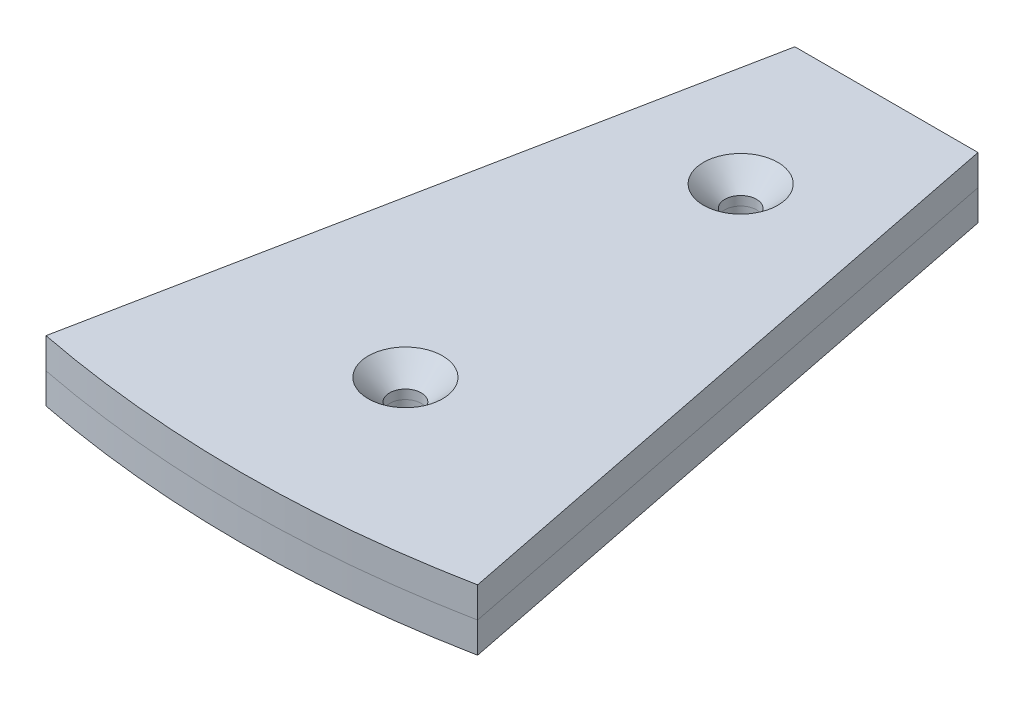
ISO-10303-21;
HEADER;
FILE_DESCRIPTION(('STEP AP214'),'2;1');
FILE_NAME('part.step','',(''),(''),'','','');
FILE_SCHEMA(('AUTOMOTIVE_DESIGN { 1 0 10303 214 1 1 1 1 }'));
ENDSEC;
DATA;
#1=APPLICATION_CONTEXT('core data for automotive mechanical design processes');
#2=APPLICATION_PROTOCOL_DEFINITION('international standard','automotive_design',2000,#1);
#3=PRODUCT_CONTEXT('',#1,'mechanical');
#4=PRODUCT('Part','Part','',(#3));
#5=PRODUCT_RELATED_PRODUCT_CATEGORY('part','',(#4));
#6=PRODUCT_DEFINITION_FORMATION('','',#4);
#7=PRODUCT_DEFINITION_CONTEXT('part definition',#1,'design');
#8=PRODUCT_DEFINITION('design','',#6,#7);
#9=PRODUCT_DEFINITION_SHAPE('','',#8);
#10=(LENGTH_UNIT() NAMED_UNIT(*) SI_UNIT(.MILLI.,.METRE.));
#11=(NAMED_UNIT(*) PLANE_ANGLE_UNIT() SI_UNIT($,.RADIAN.));
#12=(NAMED_UNIT(*) SI_UNIT($,.STERADIAN.) SOLID_ANGLE_UNIT());
#13=UNCERTAINTY_MEASURE_WITH_UNIT(LENGTH_MEASURE(1.E-05),#10,'distance_accuracy_value','');
#14=(GEOMETRIC_REPRESENTATION_CONTEXT(3) GLOBAL_UNCERTAINTY_ASSIGNED_CONTEXT((#13)) GLOBAL_UNIT_ASSIGNED_CONTEXT((#10,
#11,#12)) REPRESENTATION_CONTEXT('',''));
#15=CARTESIAN_POINT('',(0.,0.,0.));
#16=DIRECTION('',(0.,0.,1.));
#17=DIRECTION('',(1.,0.,0.));
#18=AXIS2_PLACEMENT_3D('',#15,#16,#17);
#19=CARTESIAN_POINT('',(0.,4.99,0.));
#20=DIRECTION('',(0.,-1.,0.));
#21=DIRECTION('',(0.,0.,-1.));
#22=AXIS2_PLACEMENT_3D('',#19,#20,#21);
#23=PLANE('',#22);
#24=DIRECTION('',(-1.,0.,0.));
#25=VECTOR('',#24,1.);
#26=CARTESIAN_POINT('',(0.,4.99,78.0836992813795));
#27=LINE('',#26,#25);
#28=CARTESIAN_POINT('',(15.0220178987158,4.99,78.0836992813795));
#29=VERTEX_POINT('',#28);
#30=CARTESIAN_POINT('',(-15.0220178987157,4.99,78.0836992813795));
#31=VERTEX_POINT('',#30);
#32=EDGE_CURVE('E62',#29,#31,#27,.T.);
#33=ORIENTED_EDGE('',*,*,#32,.F.);
#34=DIRECTION('',(0.195090322016121,0.,0.980785280403232));
#35=VECTOR('',#34,1.);
#36=CARTESIAN_POINT('',(14.1410563568579,4.99,73.6548065309534));
#37=LINE('',#36,#35);
#38=CARTESIAN_POINT('',(35.4060940763339,4.99,180.561370459625));
#39=VERTEX_POINT('',#38);
#40=EDGE_CURVE('E106',#29,#39,#37,.T.);
#41=ORIENTED_EDGE('',*,*,#40,.T.);
#42=CARTESIAN_POINT('',(0.,4.99,0.));
#43=DIRECTION('',(0.,-1.,0.));
#44=DIRECTION('',(0.,0.,-1.));
#45=AXIS2_PLACEMENT_3D('',#42,#43,#44);
#46=CIRCLE('',#45,184.);
#47=CARTESIAN_POINT('',(-35.4060940763338,4.99,180.561370459625));
#48=VERTEX_POINT('',#47);
#49=EDGE_CURVE('E70',#39,#48,#46,.T.);
#50=ORIENTED_EDGE('',*,*,#49,.T.);
#51=DIRECTION('',(0.195090322016121,0.,-0.980785280403232));
#52=VECTOR('',#51,1.);
#53=CARTESIAN_POINT('',(-14.1410563568579,4.99,73.6548065309534));
#54=LINE('',#53,#52);
#55=EDGE_CURVE('E100',#48,#31,#54,.T.);
#56=ORIENTED_EDGE('',*,*,#55,.T.);
#57=EDGE_LOOP('',(#33,#41,#50,#56));
#58=FACE_BOUND('',#57,.T.);
#59=CARTESIAN_POINT('',(0.,4.99,157.));
#60=DIRECTION('',(0.,-1.,0.));
#61=DIRECTION('',(0.,0.,-1.));
#62=AXIS2_PLACEMENT_3D('',#59,#60,#61);
#63=CIRCLE('',#62,2.59999999999998);
#64=CARTESIAN_POINT('',(0.,4.99,154.4));
#65=VERTEX_POINT('',#64);
#66=EDGE_CURVE('E167',#65,#65,#63,.T.);
#67=ORIENTED_EDGE('',*,*,#66,.F.);
#68=EDGE_LOOP('',(#67));
#69=FACE_BOUND('',#68,.T.);
#70=CARTESIAN_POINT('',(0.,4.99,102.));
#71=DIRECTION('',(0.,-1.,0.));
#72=DIRECTION('',(0.,0.,1.));
#73=AXIS2_PLACEMENT_3D('',#70,#71,#72);
#74=CIRCLE('',#73,2.59999999999998);
#75=CARTESIAN_POINT('',(0.,4.99,104.6));
#76=VERTEX_POINT('',#75);
#77=EDGE_CURVE('E165',#76,#76,#74,.T.);
#78=ORIENTED_EDGE('',*,*,#77,.F.);
#79=EDGE_LOOP('',(#78));
#80=FACE_BOUND('',#79,.T.);
#81=ADVANCED_FACE('F46',(#58,#69,#80),#23,.T.);
#82=CARTESIAN_POINT('',(0.,9.99,0.));
#83=DIRECTION('',(0.,-1.,0.));
#84=DIRECTION('',(0.,0.,-1.));
#85=AXIS2_PLACEMENT_3D('',#82,#83,#84);
#86=PLANE('',#85);
#87=CARTESIAN_POINT('',(0.,9.99,102.));
#88=DIRECTION('',(0.,-1.,0.));
#89=DIRECTION('',(0.,0.,-1.));
#90=AXIS2_PLACEMENT_3D('',#87,#88,#89);
#91=CIRCLE('',#90,6.09999999999997);
#92=CARTESIAN_POINT('',(0.,9.99,95.9));
#93=VERTEX_POINT('',#92);
#94=EDGE_CURVE('E115',#93,#93,#91,.T.);
#95=ORIENTED_EDGE('',*,*,#94,.T.);
#96=EDGE_LOOP('',(#95));
#97=FACE_BOUND('',#96,.T.);
#98=CARTESIAN_POINT('',(0.,9.99,157.));
#99=DIRECTION('',(0.,-1.,0.));
#100=DIRECTION('',(0.,0.,-1.));
#101=AXIS2_PLACEMENT_3D('',#98,#99,#100);
#102=CIRCLE('',#101,6.09999999999999);
#103=CARTESIAN_POINT('',(0.,9.99,150.9));
#104=VERTEX_POINT('',#103);
#105=EDGE_CURVE('E112',#104,#104,#102,.T.);
#106=ORIENTED_EDGE('',*,*,#105,.T.);
#107=EDGE_LOOP('',(#106));
#108=FACE_BOUND('',#107,.T.);
#109=DIRECTION('',(0.195090322016121,0.,0.980785280403232));
#110=VECTOR('',#109,1.);
#111=CARTESIAN_POINT('',(14.1410563568579,9.99,73.6548065309534));
#112=LINE('',#111,#110);
#113=CARTESIAN_POINT('',(15.0220178987158,9.99,78.0836992813795));
#114=VERTEX_POINT('',#113);
#115=CARTESIAN_POINT('',(35.4060940763339,9.99,180.561370459625));
#116=VERTEX_POINT('',#115);
#117=EDGE_CURVE('E94',#114,#116,#112,.T.);
#118=ORIENTED_EDGE('',*,*,#117,.F.);
#119=DIRECTION('',(-1.,0.,0.));
#120=VECTOR('',#119,1.);
#121=CARTESIAN_POINT('',(-30.5248210778353,9.99,78.0836992813795));
#122=LINE('',#121,#120);
#123=CARTESIAN_POINT('',(-15.0220178987157,9.99,78.0836992813795));
#124=VERTEX_POINT('',#123);
#125=EDGE_CURVE('E105',#114,#124,#122,.T.);
#126=ORIENTED_EDGE('',*,*,#125,.T.);
#127=DIRECTION('',(0.195090322016121,0.,-0.980785280403232));
#128=VECTOR('',#127,1.);
#129=CARTESIAN_POINT('',(-14.1410563568579,9.99,73.6548065309534));
#130=LINE('',#129,#128);
#131=CARTESIAN_POINT('',(-35.4060940763338,9.99,180.561370459625));
#132=VERTEX_POINT('',#131);
#133=EDGE_CURVE('E93',#132,#124,#130,.T.);
#134=ORIENTED_EDGE('',*,*,#133,.F.);
#135=CARTESIAN_POINT('',(0.,9.99,0.));
#136=DIRECTION('',(0.,-1.,0.));
#137=DIRECTION('',(0.,0.,-1.));
#138=AXIS2_PLACEMENT_3D('',#135,#136,#137);
#139=CIRCLE('',#138,184.);
#140=EDGE_CURVE('E83',#116,#132,#139,.T.);
#141=ORIENTED_EDGE('',*,*,#140,.F.);
#142=EDGE_LOOP('',(#118,#126,#134,#141));
#143=FACE_BOUND('',#142,.T.);
#144=ADVANCED_FACE('F103',(#97,#108,#143),#86,.F.);
#145=CARTESIAN_POINT('',(14.1410563568579,4.99,73.6548065309534));
#146=DIRECTION('',(-0.980785280403232,0.,0.195090322016121));
#147=DIRECTION('',(0.195090322016121,0.,0.980785280403232));
#148=AXIS2_PLACEMENT_3D('',#145,#146,#147);
#149=PLANE('',#148);
#150=ORIENTED_EDGE('',*,*,#40,.F.);
#151=DIRECTION('',(0.,-1.,0.));
#152=VECTOR('',#151,1.);
#153=CARTESIAN_POINT('',(15.0220178987158,9.99,78.0836992813795));
#154=LINE('',#153,#152);
#155=EDGE_CURVE('E171',#114,#29,#154,.T.);
#156=ORIENTED_EDGE('',*,*,#155,.F.);
#157=ORIENTED_EDGE('',*,*,#117,.T.);
#158=DIRECTION('',(0.,1.,0.));
#159=VECTOR('',#158,1.);
#160=CARTESIAN_POINT('',(35.4060940763339,4.99,180.561370459625));
#161=LINE('',#160,#159);
#162=EDGE_CURVE('E89',#39,#116,#161,.T.);
#163=ORIENTED_EDGE('',*,*,#162,.F.);
#164=EDGE_LOOP('',(#150,#156,#157,#163));
#165=FACE_BOUND('',#164,.T.);
#166=ADVANCED_FACE('F133',(#165),#149,.F.);
#167=CARTESIAN_POINT('',(0.,4.99,0.));
#168=DIRECTION('',(0.,1.,0.));
#169=DIRECTION('',(0.,0.,1.));
#170=AXIS2_PLACEMENT_3D('',#167,#168,#169);
#171=CYLINDRICAL_SURFACE('',#170,184.);
#172=ORIENTED_EDGE('',*,*,#140,.T.);
#173=DIRECTION('',(0.,1.,0.));
#174=VECTOR('',#173,1.);
#175=CARTESIAN_POINT('',(-35.4060940763338,4.99,180.561370459625));
#176=LINE('',#175,#174);
#177=EDGE_CURVE('E86',#48,#132,#176,.T.);
#178=ORIENTED_EDGE('',*,*,#177,.F.);
#179=ORIENTED_EDGE('',*,*,#49,.F.);
#180=ORIENTED_EDGE('',*,*,#162,.T.);
#181=EDGE_LOOP('',(#172,#178,#179,#180));
#182=FACE_BOUND('',#181,.T.);
#183=ADVANCED_FACE('F85',(#182),#171,.T.);
#184=CARTESIAN_POINT('',(-14.1410563568579,4.99,73.6548065309534));
#185=DIRECTION('',(0.980785280403232,0.,0.195090322016121));
#186=DIRECTION('',(0.195090322016121,0.,-0.980785280403232));
#187=AXIS2_PLACEMENT_3D('',#184,#185,#186);
#188=PLANE('',#187);
#189=ORIENTED_EDGE('',*,*,#133,.T.);
#190=DIRECTION('',(0.,-1.,0.));
#191=VECTOR('',#190,1.);
#192=CARTESIAN_POINT('',(-15.0220178987157,4.99,78.0836992813795));
#193=LINE('',#192,#191);
#194=EDGE_CURVE('E12',#124,#31,#193,.T.);
#195=ORIENTED_EDGE('',*,*,#194,.T.);
#196=ORIENTED_EDGE('',*,*,#55,.F.);
#197=ORIENTED_EDGE('',*,*,#177,.T.);
#198=EDGE_LOOP('',(#189,#195,#196,#197));
#199=FACE_BOUND('',#198,.T.);
#200=ADVANCED_FACE('F98',(#199),#188,.F.);
#201=CARTESIAN_POINT('',(0.,4.99,157.));
#202=DIRECTION('',(0.,1.,0.));
#203=DIRECTION('',(0.,0.,1.));
#204=AXIS2_PLACEMENT_3D('',#201,#202,#203);
#205=CYLINDRICAL_SURFACE('',#204,2.59999999999998);
#206=CARTESIAN_POINT('',(0.,6.49000000000001,157.));
#207=DIRECTION('',(0.,-1.,0.));
#208=DIRECTION('',(0.,0.,-1.));
#209=AXIS2_PLACEMENT_3D('',#206,#207,#208);
#210=CIRCLE('',#209,2.59999999999998);
#211=CARTESIAN_POINT('',(0.,6.49000000000001,154.4));
#212=VERTEX_POINT('',#211);
#213=EDGE_CURVE('E55',#212,#212,#210,.F.);
#214=ORIENTED_EDGE('',*,*,#213,.T.);
#215=EDGE_LOOP('',(#214));
#216=FACE_BOUND('',#215,.T.);
#217=ORIENTED_EDGE('',*,*,#66,.T.);
#218=EDGE_LOOP('',(#217));
#219=FACE_BOUND('',#218,.T.);
#220=ADVANCED_FACE('F123',(#216,#219),#205,.F.);
#221=CARTESIAN_POINT('',(0.,4.99,102.));
#222=DIRECTION('',(0.,1.,0.));
#223=DIRECTION('',(0.,0.,1.));
#224=AXIS2_PLACEMENT_3D('',#221,#222,#223);
#225=CYLINDRICAL_SURFACE('',#224,2.59999999999998);
#226=CARTESIAN_POINT('',(0.,6.49000000000002,102.));
#227=DIRECTION('',(0.,-1.,0.));
#228=DIRECTION('',(0.,0.,-1.));
#229=AXIS2_PLACEMENT_3D('',#226,#227,#228);
#230=CIRCLE('',#229,2.59999999999998);
#231=CARTESIAN_POINT('',(0.,6.49000000000002,99.4));
#232=VERTEX_POINT('',#231);
#233=EDGE_CURVE('E118',#232,#232,#230,.F.);
#234=ORIENTED_EDGE('',*,*,#233,.T.);
#235=EDGE_LOOP('',(#234));
#236=FACE_BOUND('',#235,.T.);
#237=ORIENTED_EDGE('',*,*,#77,.T.);
#238=EDGE_LOOP('',(#237));
#239=FACE_BOUND('',#238,.T.);
#240=ADVANCED_FACE('F152',(#236,#239),#225,.F.);
#241=CARTESIAN_POINT('',(0.,9.99,102.));
#242=DIRECTION('',(0.,1.,0.));
#243=DIRECTION('',(0.,0.,1.));
#244=AXIS2_PLACEMENT_3D('',#241,#242,#243);
#245=CONICAL_SURFACE('',#244,6.09999999999997,0.785398163397448);
#246=ORIENTED_EDGE('',*,*,#233,.F.);
#247=EDGE_LOOP('',(#246));
#248=FACE_BOUND('',#247,.T.);
#249=ORIENTED_EDGE('',*,*,#94,.F.);
#250=EDGE_LOOP('',(#249));
#251=FACE_BOUND('',#250,.T.);
#252=ADVANCED_FACE('F129',(#248,#251),#245,.F.);
#253=CARTESIAN_POINT('',(0.,9.99,157.));
#254=DIRECTION('',(0.,1.,0.));
#255=DIRECTION('',(0.,0.,1.));
#256=AXIS2_PLACEMENT_3D('',#253,#254,#255);
#257=CONICAL_SURFACE('',#256,6.09999999999999,0.785398163397451);
#258=ORIENTED_EDGE('',*,*,#213,.F.);
#259=EDGE_LOOP('',(#258));
#260=FACE_BOUND('',#259,.T.);
#261=ORIENTED_EDGE('',*,*,#105,.F.);
#262=EDGE_LOOP('',(#261));
#263=FACE_BOUND('',#262,.T.);
#264=ADVANCED_FACE('F49',(#260,#263),#257,.F.);
#265=CARTESIAN_POINT('',(-30.5248210778353,9.99,78.0836992813795));
#266=DIRECTION('',(0.,0.,1.));
#267=DIRECTION('',(1.,0.,0.));
#268=AXIS2_PLACEMENT_3D('',#265,#266,#267);
#269=PLANE('',#268);
#270=ORIENTED_EDGE('',*,*,#32,.T.);
#271=ORIENTED_EDGE('',*,*,#194,.F.);
#272=ORIENTED_EDGE('',*,*,#125,.F.);
#273=ORIENTED_EDGE('',*,*,#155,.T.);
#274=EDGE_LOOP('',(#270,#271,#272,#273));
#275=FACE_BOUND('',#274,.T.);
#276=ADVANCED_FACE('F128',(#275),#269,.F.);
#277=CLOSED_SHELL('',(#81,#144,#166,#183,#200,#220,#240,#252,#264,#276));
#278=MANIFOLD_SOLID_BREP('B2',#277);
#279=CARTESIAN_POINT('',(0.,-0.00999999999999959,0.));
#280=DIRECTION('',(0.,-1.,0.));
#281=DIRECTION('',(0.,0.,-1.));
#282=AXIS2_PLACEMENT_3D('',#279,#280,#281);
#283=PLANE('',#282);
#284=DIRECTION('',(-1.,0.,0.));
#285=VECTOR('',#284,1.);
#286=CARTESIAN_POINT('',(-30.5248210778353,-0.00999999999999959,78.0836992813795));
#287=LINE('',#286,#285);
#288=CARTESIAN_POINT('',(15.0220178987158,-0.00999999999999959,78.0836992813795));
#289=VERTEX_POINT('',#288);
#290=CARTESIAN_POINT('',(-15.0220178987157,-0.00999999999999959,78.0836992813795));
#291=VERTEX_POINT('',#290);
#292=EDGE_CURVE('E263',#289,#291,#287,.T.);
#293=ORIENTED_EDGE('',*,*,#292,.F.);
#294=DIRECTION('',(0.195090322016121,0.,0.980785280403232));
#295=VECTOR('',#294,1.);
#296=CARTESIAN_POINT('',(14.1410563568579,-0.00999999999999959,73.6548065309534));
#297=LINE('',#296,#295);
#298=CARTESIAN_POINT('',(35.4060940763339,-0.00999999999999959,180.561370459625));
#299=VERTEX_POINT('',#298);
#300=EDGE_CURVE('E307',#289,#299,#297,.T.);
#301=ORIENTED_EDGE('',*,*,#300,.T.);
#302=CARTESIAN_POINT('',(0.,-0.00999999999999959,0.));
#303=DIRECTION('',(0.,-1.,0.));
#304=DIRECTION('',(0.,0.,-1.));
#305=AXIS2_PLACEMENT_3D('',#302,#303,#304);
#306=CIRCLE('',#305,184.);
#307=CARTESIAN_POINT('',(-35.4060940763338,-0.00999999999999959,180.561370459625));
#308=VERTEX_POINT('',#307);
#309=EDGE_CURVE('E271',#299,#308,#306,.T.);
#310=ORIENTED_EDGE('',*,*,#309,.T.);
#311=DIRECTION('',(0.195090322016121,0.,-0.980785280403232));
#312=VECTOR('',#311,1.);
#313=CARTESIAN_POINT('',(-35.4060940763338,-0.00999999999999959,180.561370459625));
#314=LINE('',#313,#312);
#315=EDGE_CURVE('E300',#308,#291,#314,.T.);
#316=ORIENTED_EDGE('',*,*,#315,.T.);
#317=EDGE_LOOP('',(#293,#301,#310,#316));
#318=FACE_BOUND('',#317,.T.);
#319=CARTESIAN_POINT('',(0.,-0.00999999999999959,102.));
#320=DIRECTION('',(0.,-1.,0.));
#321=DIRECTION('',(0.,0.,-1.));
#322=AXIS2_PLACEMENT_3D('',#319,#320,#321);
#323=CIRCLE('',#322,6.10000000000002);
#324=CARTESIAN_POINT('',(0.,-0.00999999999999959,95.9));
#325=VERTEX_POINT('',#324);
#326=EDGE_CURVE('E319',#325,#325,#323,.F.);
#327=ORIENTED_EDGE('',*,*,#326,.T.);
#328=EDGE_LOOP('',(#327));
#329=FACE_BOUND('',#328,.T.);
#330=CARTESIAN_POINT('',(0.,-0.00999999999999959,157.));
#331=DIRECTION('',(0.,-1.,0.));
#332=DIRECTION('',(0.,0.,-1.));
#333=AXIS2_PLACEMENT_3D('',#330,#331,#332);
#334=CIRCLE('',#333,6.10000000000002);
#335=CARTESIAN_POINT('',(0.,-0.00999999999999959,150.9));
#336=VERTEX_POINT('',#335);
#337=EDGE_CURVE('E316',#336,#336,#334,.F.);
#338=ORIENTED_EDGE('',*,*,#337,.T.);
#339=EDGE_LOOP('',(#338));
#340=FACE_BOUND('',#339,.T.);
#341=ADVANCED_FACE('F247',(#318,#329,#340),#283,.T.);
#342=CARTESIAN_POINT('',(0.,4.99,0.));
#343=DIRECTION('',(0.,-1.,0.));
#344=DIRECTION('',(0.,0.,-1.));
#345=AXIS2_PLACEMENT_3D('',#342,#343,#344);
#346=PLANE('',#345);
#347=DIRECTION('',(0.195090322016121,0.,0.980785280403232));
#348=VECTOR('',#347,1.);
#349=CARTESIAN_POINT('',(14.1410563568579,4.99,73.6548065309534));
#350=LINE('',#349,#348);
#351=CARTESIAN_POINT('',(15.0220178987158,4.99,78.0836992813795));
#352=VERTEX_POINT('',#351);
#353=CARTESIAN_POINT('',(35.4060940763339,4.99,180.561370459625));
#354=VERTEX_POINT('',#353);
#355=EDGE_CURVE('E295',#352,#354,#350,.T.);
#356=ORIENTED_EDGE('',*,*,#355,.F.);
#357=DIRECTION('',(-1.,0.,0.));
#358=VECTOR('',#357,1.);
#359=CARTESIAN_POINT('',(0.,4.99,78.0836992813795));
#360=LINE('',#359,#358);
#361=CARTESIAN_POINT('',(-15.0220178987157,4.99,78.0836992813795));
#362=VERTEX_POINT('',#361);
#363=EDGE_CURVE('E306',#352,#362,#360,.T.);
#364=ORIENTED_EDGE('',*,*,#363,.T.);
#365=DIRECTION('',(0.195090322016121,0.,-0.980785280403232));
#366=VECTOR('',#365,1.);
#367=CARTESIAN_POINT('',(-35.4060940763338,4.99,180.561370459625));
#368=LINE('',#367,#366);
#369=CARTESIAN_POINT('',(-35.4060940763338,4.99,180.561370459625));
#370=VERTEX_POINT('',#369);
#371=EDGE_CURVE('E294',#370,#362,#368,.T.);
#372=ORIENTED_EDGE('',*,*,#371,.F.);
#373=CARTESIAN_POINT('',(0.,4.99,0.));
#374=DIRECTION('',(0.,-1.,0.));
#375=DIRECTION('',(0.,0.,-1.));
#376=AXIS2_PLACEMENT_3D('',#373,#374,#375);
#377=CIRCLE('',#376,184.);
#378=EDGE_CURVE('E284',#354,#370,#377,.T.);
#379=ORIENTED_EDGE('',*,*,#378,.F.);
#380=EDGE_LOOP('',(#356,#364,#372,#379));
#381=FACE_BOUND('',#380,.T.);
#382=CARTESIAN_POINT('',(0.,4.99,102.));
#383=DIRECTION('',(0.,-1.,0.));
#384=DIRECTION('',(0.,0.,-1.));
#385=AXIS2_PLACEMENT_3D('',#382,#383,#384);
#386=CIRCLE('',#385,2.59999999999999);
#387=CARTESIAN_POINT('',(0.,4.99,99.4));
#388=VERTEX_POINT('',#387);
#389=EDGE_CURVE('E376',#388,#388,#386,.T.);
#390=ORIENTED_EDGE('',*,*,#389,.T.);
#391=EDGE_LOOP('',(#390));
#392=FACE_BOUND('',#391,.T.);
#393=CARTESIAN_POINT('',(0.,4.99,157.));
#394=DIRECTION('',(0.,-1.,0.));
#395=DIRECTION('',(0.,0.,-1.));
#396=AXIS2_PLACEMENT_3D('',#393,#394,#395);
#397=CIRCLE('',#396,2.59999999999999);
#398=CARTESIAN_POINT('',(0.,4.99,154.4));
#399=VERTEX_POINT('',#398);
#400=EDGE_CURVE('E373',#399,#399,#397,.T.);
#401=ORIENTED_EDGE('',*,*,#400,.T.);
#402=EDGE_LOOP('',(#401));
#403=FACE_BOUND('',#402,.T.);
#404=ADVANCED_FACE('F303',(#381,#392,#403),#346,.F.);
#405=CARTESIAN_POINT('',(14.1410563568579,-0.00999999999999959,73.6548065309534));
#406=DIRECTION('',(-0.980785280403232,0.,0.195090322016121));
#407=DIRECTION('',(0.195090322016121,0.,0.980785280403232));
#408=AXIS2_PLACEMENT_3D('',#405,#406,#407);
#409=PLANE('',#408);
#410=ORIENTED_EDGE('',*,*,#300,.F.);
#411=DIRECTION('',(0.,-1.,0.));
#412=VECTOR('',#411,1.);
#413=CARTESIAN_POINT('',(15.0220178987158,9.99,78.0836992813795));
#414=LINE('',#413,#412);
#415=EDGE_CURVE('E367',#352,#289,#414,.T.);
#416=ORIENTED_EDGE('',*,*,#415,.F.);
#417=ORIENTED_EDGE('',*,*,#355,.T.);
#418=DIRECTION('',(0.,1.,0.));
#419=VECTOR('',#418,1.);
#420=CARTESIAN_POINT('',(35.4060940763339,-0.00999999999999959,180.561370459625));
#421=LINE('',#420,#419);
#422=EDGE_CURVE('E290',#299,#354,#421,.T.);
#423=ORIENTED_EDGE('',*,*,#422,.F.);
#424=EDGE_LOOP('',(#410,#416,#417,#423));
#425=FACE_BOUND('',#424,.T.);
#426=ADVANCED_FACE('F343',(#425),#409,.F.);
#427=CARTESIAN_POINT('',(0.,-0.00999999999999959,0.));
#428=DIRECTION('',(0.,1.,0.));
#429=DIRECTION('',(0.,0.,1.));
#430=AXIS2_PLACEMENT_3D('',#427,#428,#429);
#431=CYLINDRICAL_SURFACE('',#430,184.);
#432=ORIENTED_EDGE('',*,*,#378,.T.);
#433=DIRECTION('',(0.,1.,0.));
#434=VECTOR('',#433,1.);
#435=CARTESIAN_POINT('',(-35.4060940763338,-0.00999999999999959,180.561370459625));
#436=LINE('',#435,#434);
#437=EDGE_CURVE('E287',#308,#370,#436,.T.);
#438=ORIENTED_EDGE('',*,*,#437,.F.);
#439=ORIENTED_EDGE('',*,*,#309,.F.);
#440=ORIENTED_EDGE('',*,*,#422,.T.);
#441=EDGE_LOOP('',(#432,#438,#439,#440));
#442=FACE_BOUND('',#441,.T.);
#443=ADVANCED_FACE('F286',(#442),#431,.T.);
#444=CARTESIAN_POINT('',(-35.4060940763338,-0.00999999999999959,180.561370459625));
#445=DIRECTION('',(0.980785280403232,0.,0.195090322016121));
#446=DIRECTION('',(0.195090322016121,0.,-0.980785280403232));
#447=AXIS2_PLACEMENT_3D('',#444,#445,#446);
#448=PLANE('',#447);
#449=ORIENTED_EDGE('',*,*,#371,.T.);
#450=DIRECTION('',(0.,-1.,0.));
#451=VECTOR('',#450,1.);
#452=CARTESIAN_POINT('',(-15.0220178987157,-0.00999999999999959,78.0836992813795));
#453=LINE('',#452,#451);
#454=EDGE_CURVE('E44',#362,#291,#453,.T.);
#455=ORIENTED_EDGE('',*,*,#454,.T.);
#456=ORIENTED_EDGE('',*,*,#315,.F.);
#457=ORIENTED_EDGE('',*,*,#437,.T.);
#458=EDGE_LOOP('',(#449,#455,#456,#457));
#459=FACE_BOUND('',#458,.T.);
#460=ADVANCED_FACE('F299',(#459),#448,.F.);
#461=CARTESIAN_POINT('',(0.,-0.00999999999999959,102.));
#462=DIRECTION('',(0.,1.,0.));
#463=DIRECTION('',(0.,0.,1.));
#464=AXIS2_PLACEMENT_3D('',#461,#462,#463);
#465=CYLINDRICAL_SURFACE('',#464,2.59999999999999);
#466=CARTESIAN_POINT('',(0.,3.49000000000001,102.));
#467=DIRECTION('',(0.,-1.,0.));
#468=DIRECTION('',(0.,0.,-1.));
#469=AXIS2_PLACEMENT_3D('',#466,#467,#468);
#470=CIRCLE('',#469,2.59999999999999);
#471=CARTESIAN_POINT('',(0.,3.49000000000001,99.4));
#472=VERTEX_POINT('',#471);
#473=EDGE_CURVE('E313',#472,#472,#470,.T.);
#474=ORIENTED_EDGE('',*,*,#473,.T.);
#475=EDGE_LOOP('',(#474));
#476=FACE_BOUND('',#475,.T.);
#477=ORIENTED_EDGE('',*,*,#389,.F.);
#478=EDGE_LOOP('',(#477));
#479=FACE_BOUND('',#478,.T.);
#480=ADVANCED_FACE('F347',(#476,#479),#465,.F.);
#481=CARTESIAN_POINT('',(0.,-0.00999999999999959,157.));
#482=DIRECTION('',(0.,1.,0.));
#483=DIRECTION('',(0.,0.,1.));
#484=AXIS2_PLACEMENT_3D('',#481,#482,#483);
#485=CYLINDRICAL_SURFACE('',#484,2.59999999999999);
#486=CARTESIAN_POINT('',(0.,3.49000000000001,157.));
#487=DIRECTION('',(0.,-1.,0.));
#488=DIRECTION('',(0.,0.,-1.));
#489=AXIS2_PLACEMENT_3D('',#486,#487,#488);
#490=CIRCLE('',#489,2.59999999999999);
#491=CARTESIAN_POINT('',(0.,3.49000000000001,154.4));
#492=VERTEX_POINT('',#491);
#493=EDGE_CURVE('E256',#492,#492,#490,.T.);
#494=ORIENTED_EDGE('',*,*,#493,.T.);
#495=EDGE_LOOP('',(#494));
#496=FACE_BOUND('',#495,.T.);
#497=ORIENTED_EDGE('',*,*,#400,.F.);
#498=EDGE_LOOP('',(#497));
#499=FACE_BOUND('',#498,.T.);
#500=ADVANCED_FACE('F324',(#496,#499),#485,.F.);
#501=CARTESIAN_POINT('',(0.,3.49000000000001,102.));
#502=DIRECTION('',(0.,-1.,0.));
#503=DIRECTION('',(0.,0.,-1.));
#504=AXIS2_PLACEMENT_3D('',#501,#502,#503);
#505=CONICAL_SURFACE('',#504,2.59999999999999,0.785398163397451);
#506=ORIENTED_EDGE('',*,*,#326,.F.);
#507=EDGE_LOOP('',(#506));
#508=FACE_BOUND('',#507,.T.);
#509=ORIENTED_EDGE('',*,*,#473,.F.);
#510=EDGE_LOOP('',(#509));
#511=FACE_BOUND('',#510,.T.);
#512=ADVANCED_FACE('F329',(#508,#511),#505,.F.);
#513=CARTESIAN_POINT('',(0.,3.49000000000001,157.));
#514=DIRECTION('',(0.,-1.,0.));
#515=DIRECTION('',(0.,0.,-1.));
#516=AXIS2_PLACEMENT_3D('',#513,#514,#515);
#517=CONICAL_SURFACE('',#516,2.59999999999999,0.785398163397451);
#518=ORIENTED_EDGE('',*,*,#337,.F.);
#519=EDGE_LOOP('',(#518));
#520=FACE_BOUND('',#519,.T.);
#521=ORIENTED_EDGE('',*,*,#493,.F.);
#522=EDGE_LOOP('',(#521));
#523=FACE_BOUND('',#522,.T.);
#524=ADVANCED_FACE('F250',(#520,#523),#517,.F.);
#525=CARTESIAN_POINT('',(-30.5248210778353,9.99,78.0836992813795));
#526=DIRECTION('',(0.,0.,1.));
#527=DIRECTION('',(1.,0.,0.));
#528=AXIS2_PLACEMENT_3D('',#525,#526,#527);
#529=PLANE('',#528);
#530=ORIENTED_EDGE('',*,*,#415,.T.);
#531=ORIENTED_EDGE('',*,*,#292,.T.);
#532=ORIENTED_EDGE('',*,*,#454,.F.);
#533=ORIENTED_EDGE('',*,*,#363,.F.);
#534=EDGE_LOOP('',(#530,#531,#532,#533));
#535=FACE_BOUND('',#534,.T.);
#536=ADVANCED_FACE('F328',(#535),#529,.F.);
#537=CLOSED_SHELL('',(#341,#404,#426,#443,#460,#480,#500,#512,#524,#536));
#538=MANIFOLD_SOLID_BREP('B6',#537);
#539=ADVANCED_BREP_SHAPE_REPRESENTATION('',(#18,#278,#538),#14);
#540=SHAPE_DEFINITION_REPRESENTATION(#9,#539);
ENDSEC;
END-ISO-10303-21;
